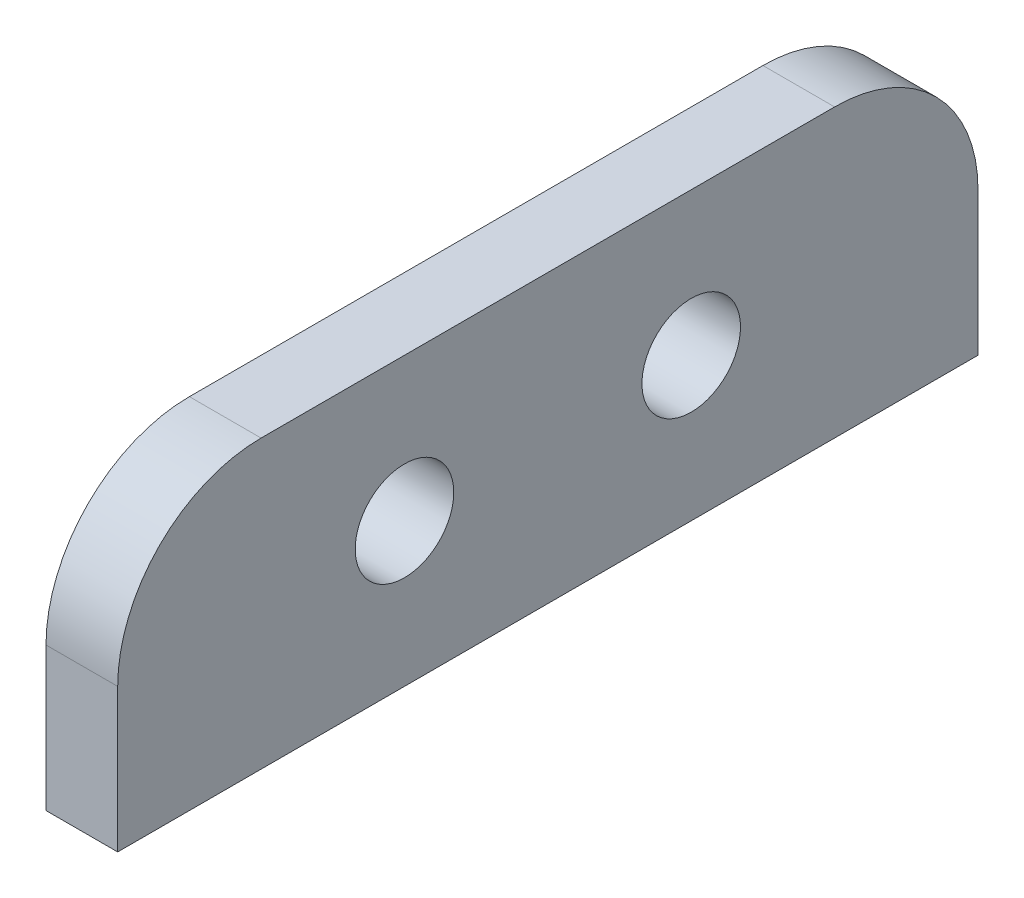
ISO-10303-21;
HEADER;
FILE_DESCRIPTION(('STEP AP214'),'2;1');
FILE_NAME('part.step','',(''),(''),'','','');
FILE_SCHEMA(('AUTOMOTIVE_DESIGN { 1 0 10303 214 1 1 1 1 }'));
ENDSEC;
DATA;
#1=APPLICATION_CONTEXT('core data for automotive mechanical design processes');
#2=APPLICATION_PROTOCOL_DEFINITION('international standard','automotive_design',2000,#1);
#3=PRODUCT_CONTEXT('',#1,'mechanical');
#4=PRODUCT('Part','Part','',(#3));
#5=PRODUCT_RELATED_PRODUCT_CATEGORY('part','',(#4));
#6=PRODUCT_DEFINITION_FORMATION('','',#4);
#7=PRODUCT_DEFINITION_CONTEXT('part definition',#1,'design');
#8=PRODUCT_DEFINITION('design','',#6,#7);
#9=PRODUCT_DEFINITION_SHAPE('','',#8);
#10=(LENGTH_UNIT() NAMED_UNIT(*) SI_UNIT(.MILLI.,.METRE.));
#11=(NAMED_UNIT(*) PLANE_ANGLE_UNIT() SI_UNIT($,.RADIAN.));
#12=(NAMED_UNIT(*) SI_UNIT($,.STERADIAN.) SOLID_ANGLE_UNIT());
#13=UNCERTAINTY_MEASURE_WITH_UNIT(LENGTH_MEASURE(1.E-05),#10,'distance_accuracy_value','');
#14=(GEOMETRIC_REPRESENTATION_CONTEXT(3) GLOBAL_UNCERTAINTY_ASSIGNED_CONTEXT((#13)) GLOBAL_UNIT_ASSIGNED_CONTEXT((#10,
#11,#12)) REPRESENTATION_CONTEXT('',''));
#15=CARTESIAN_POINT('',(0.,0.,0.));
#16=DIRECTION('',(0.,0.,1.));
#17=DIRECTION('',(1.,0.,0.));
#18=AXIS2_PLACEMENT_3D('',#15,#16,#17);
#19=CARTESIAN_POINT('',(4.,0.,0.));
#20=DIRECTION('',(1.,0.,0.));
#21=DIRECTION('',(0.,0.,-1.));
#22=AXIS2_PLACEMENT_3D('',#19,#20,#21);
#23=PLANE('',#22);
#24=CARTESIAN_POINT('',(4.,0.,8.));
#25=DIRECTION('',(1.,0.,0.));
#26=DIRECTION('',(0.,0.,-1.));
#27=AXIS2_PLACEMENT_3D('',#24,#25,#26);
#28=CIRCLE('',#27,2.75);
#29=CARTESIAN_POINT('',(4.,0.,5.25));
#30=VERTEX_POINT('',#29);
#31=EDGE_CURVE('E143',#30,#30,#28,.T.);
#32=ORIENTED_EDGE('',*,*,#31,.F.);
#33=EDGE_LOOP('',(#32));
#34=FACE_BOUND('',#33,.T.);
#35=DIRECTION('',(0.,0.,1.));
#36=VECTOR('',#35,1.);
#37=CARTESIAN_POINT('',(4.,8.,-24.));
#38=LINE('',#37,#36);
#39=CARTESIAN_POINT('',(4.,8.,-16.));
#40=VERTEX_POINT('',#39);
#41=CARTESIAN_POINT('',(4.,8.,16.));
#42=VERTEX_POINT('',#41);
#43=EDGE_CURVE('E115',#40,#42,#38,.T.);
#44=ORIENTED_EDGE('',*,*,#43,.T.);
#45=CARTESIAN_POINT('',(4.,0.,16.));
#46=DIRECTION('',(1.,0.,0.));
#47=DIRECTION('',(0.,0.,-1.));
#48=AXIS2_PLACEMENT_3D('',#45,#46,#47);
#49=CIRCLE('',#48,8.);
#50=CARTESIAN_POINT('',(4.,0.,24.));
#51=VERTEX_POINT('',#50);
#52=EDGE_CURVE('E41',#42,#51,#49,.T.);
#53=ORIENTED_EDGE('',*,*,#52,.T.);
#54=DIRECTION('',(0.,-1.,0.));
#55=VECTOR('',#54,1.);
#56=CARTESIAN_POINT('',(4.,-8.,24.));
#57=LINE('',#56,#55);
#58=CARTESIAN_POINT('',(4.,-8.,24.));
#59=VERTEX_POINT('',#58);
#60=EDGE_CURVE('E87',#51,#59,#57,.T.);
#61=ORIENTED_EDGE('',*,*,#60,.T.);
#62=DIRECTION('',(0.,0.,-1.));
#63=VECTOR('',#62,1.);
#64=CARTESIAN_POINT('',(4.,-8.,-24.));
#65=LINE('',#64,#63);
#66=CARTESIAN_POINT('',(4.,-8.,-24.));
#67=VERTEX_POINT('',#66);
#68=EDGE_CURVE('E90',#59,#67,#65,.T.);
#69=ORIENTED_EDGE('',*,*,#68,.T.);
#70=DIRECTION('',(0.,1.,0.));
#71=VECTOR('',#70,1.);
#72=CARTESIAN_POINT('',(4.,-8.,-24.));
#73=LINE('',#72,#71);
#74=CARTESIAN_POINT('',(4.,0.,-24.));
#75=VERTEX_POINT('',#74);
#76=EDGE_CURVE('E105',#67,#75,#73,.T.);
#77=ORIENTED_EDGE('',*,*,#76,.T.);
#78=CARTESIAN_POINT('',(4.,0.,-16.));
#79=DIRECTION('',(1.,0.,0.));
#80=DIRECTION('',(0.,0.,-1.));
#81=AXIS2_PLACEMENT_3D('',#78,#79,#80);
#82=CIRCLE('',#81,8.);
#83=EDGE_CURVE('E126',#75,#40,#82,.T.);
#84=ORIENTED_EDGE('',*,*,#83,.T.);
#85=EDGE_LOOP('',(#44,#53,#61,#69,#77,#84));
#86=FACE_BOUND('',#85,.T.);
#87=CARTESIAN_POINT('',(4.,0.,-8.));
#88=DIRECTION('',(1.,0.,0.));
#89=DIRECTION('',(0.,0.,-1.));
#90=AXIS2_PLACEMENT_3D('',#87,#88,#89);
#91=CIRCLE('',#90,2.75);
#92=CARTESIAN_POINT('',(4.,0.,-10.75));
#93=VERTEX_POINT('',#92);
#94=EDGE_CURVE('E149',#93,#93,#91,.T.);
#95=ORIENTED_EDGE('',*,*,#94,.F.);
#96=EDGE_LOOP('',(#95));
#97=FACE_BOUND('',#96,.T.);
#98=ADVANCED_FACE('F33',(#34,#86,#97),#23,.T.);
#99=CARTESIAN_POINT('',(0.,0.,0.));
#100=DIRECTION('',(1.,0.,0.));
#101=DIRECTION('',(0.,0.,-1.));
#102=AXIS2_PLACEMENT_3D('',#99,#100,#101);
#103=PLANE('',#102);
#104=DIRECTION('',(0.,-1.,0.));
#105=VECTOR('',#104,1.);
#106=CARTESIAN_POINT('',(0.,-8.,24.));
#107=LINE('',#106,#105);
#108=CARTESIAN_POINT('',(0.,0.,24.));
#109=VERTEX_POINT('',#108);
#110=CARTESIAN_POINT('',(0.,-8.,24.));
#111=VERTEX_POINT('',#110);
#112=EDGE_CURVE('E109',#109,#111,#107,.T.);
#113=ORIENTED_EDGE('',*,*,#112,.F.);
#114=CARTESIAN_POINT('',(0.,0.,16.));
#115=DIRECTION('',(1.,0.,0.));
#116=DIRECTION('',(0.,0.,-1.));
#117=AXIS2_PLACEMENT_3D('',#114,#115,#116);
#118=CIRCLE('',#117,8.);
#119=CARTESIAN_POINT('',(0.,8.,16.));
#120=VERTEX_POINT('',#119);
#121=EDGE_CURVE('E120',#109,#120,#118,.F.);
#122=ORIENTED_EDGE('',*,*,#121,.T.);
#123=DIRECTION('',(0.,0.,1.));
#124=VECTOR('',#123,1.);
#125=CARTESIAN_POINT('',(0.,8.,-24.));
#126=LINE('',#125,#124);
#127=CARTESIAN_POINT('',(0.,8.,-16.));
#128=VERTEX_POINT('',#127);
#129=EDGE_CURVE('E97',#128,#120,#126,.T.);
#130=ORIENTED_EDGE('',*,*,#129,.F.);
#131=CARTESIAN_POINT('',(0.,0.,-16.));
#132=DIRECTION('',(1.,0.,0.));
#133=DIRECTION('',(0.,0.,-1.));
#134=AXIS2_PLACEMENT_3D('',#131,#132,#133);
#135=CIRCLE('',#134,8.);
#136=CARTESIAN_POINT('',(0.,0.,-24.));
#137=VERTEX_POINT('',#136);
#138=EDGE_CURVE('E113',#128,#137,#135,.F.);
#139=ORIENTED_EDGE('',*,*,#138,.T.);
#140=DIRECTION('',(0.,1.,0.));
#141=VECTOR('',#140,1.);
#142=CARTESIAN_POINT('',(0.,-8.,-24.));
#143=LINE('',#142,#141);
#144=CARTESIAN_POINT('',(0.,-8.,-24.));
#145=VERTEX_POINT('',#144);
#146=EDGE_CURVE('E137',#145,#137,#143,.T.);
#147=ORIENTED_EDGE('',*,*,#146,.F.);
#148=DIRECTION('',(0.,0.,-1.));
#149=VECTOR('',#148,1.);
#150=CARTESIAN_POINT('',(0.,-8.,-24.));
#151=LINE('',#150,#149);
#152=EDGE_CURVE('E139',#111,#145,#151,.T.);
#153=ORIENTED_EDGE('',*,*,#152,.F.);
#154=EDGE_LOOP('',(#113,#122,#130,#139,#147,#153));
#155=FACE_BOUND('',#154,.T.);
#156=CARTESIAN_POINT('',(0.,0.,8.));
#157=DIRECTION('',(1.,0.,0.));
#158=DIRECTION('',(0.,0.,-1.));
#159=AXIS2_PLACEMENT_3D('',#156,#157,#158);
#160=CIRCLE('',#159,2.75);
#161=CARTESIAN_POINT('',(0.,0.,5.25));
#162=VERTEX_POINT('',#161);
#163=EDGE_CURVE('E146',#162,#162,#160,.T.);
#164=ORIENTED_EDGE('',*,*,#163,.T.);
#165=EDGE_LOOP('',(#164));
#166=FACE_BOUND('',#165,.T.);
#167=CARTESIAN_POINT('',(0.,0.,-8.));
#168=DIRECTION('',(1.,0.,0.));
#169=DIRECTION('',(0.,0.,-1.));
#170=AXIS2_PLACEMENT_3D('',#167,#168,#169);
#171=CIRCLE('',#170,2.75);
#172=CARTESIAN_POINT('',(0.,0.,-10.75));
#173=VERTEX_POINT('',#172);
#174=EDGE_CURVE('E152',#173,#173,#171,.T.);
#175=ORIENTED_EDGE('',*,*,#174,.T.);
#176=EDGE_LOOP('',(#175));
#177=FACE_BOUND('',#176,.T.);
#178=ADVANCED_FACE('F135',(#155,#166,#177),#103,.F.);
#179=CARTESIAN_POINT('',(4.,-8.,24.));
#180=DIRECTION('',(0.,0.,-1.));
#181=DIRECTION('',(-1.,0.,0.));
#182=AXIS2_PLACEMENT_3D('',#179,#180,#181);
#183=PLANE('',#182);
#184=ORIENTED_EDGE('',*,*,#60,.F.);
#185=DIRECTION('',(-1.,0.,0.));
#186=VECTOR('',#185,1.);
#187=CARTESIAN_POINT('',(4.,0.,24.));
#188=LINE('',#187,#186);
#189=EDGE_CURVE('E111',#51,#109,#188,.T.);
#190=ORIENTED_EDGE('',*,*,#189,.T.);
#191=ORIENTED_EDGE('',*,*,#112,.T.);
#192=DIRECTION('',(-1.,0.,0.));
#193=VECTOR('',#192,1.);
#194=CARTESIAN_POINT('',(4.,-8.,24.));
#195=LINE('',#194,#193);
#196=EDGE_CURVE('E102',#59,#111,#195,.T.);
#197=ORIENTED_EDGE('',*,*,#196,.F.);
#198=EDGE_LOOP('',(#184,#190,#191,#197));
#199=FACE_BOUND('',#198,.T.);
#200=ADVANCED_FACE('F107',(#199),#183,.F.);
#201=CARTESIAN_POINT('',(4.,-8.,-24.));
#202=DIRECTION('',(0.,1.,0.));
#203=DIRECTION('',(0.,0.,1.));
#204=AXIS2_PLACEMENT_3D('',#201,#202,#203);
#205=PLANE('',#204);
#206=ORIENTED_EDGE('',*,*,#152,.T.);
#207=DIRECTION('',(-1.,0.,0.));
#208=VECTOR('',#207,1.);
#209=CARTESIAN_POINT('',(4.,-8.,-24.));
#210=LINE('',#209,#208);
#211=EDGE_CURVE('E104',#67,#145,#210,.T.);
#212=ORIENTED_EDGE('',*,*,#211,.F.);
#213=ORIENTED_EDGE('',*,*,#68,.F.);
#214=ORIENTED_EDGE('',*,*,#196,.T.);
#215=EDGE_LOOP('',(#206,#212,#213,#214));
#216=FACE_BOUND('',#215,.T.);
#217=ADVANCED_FACE('F101',(#216),#205,.F.);
#218=CARTESIAN_POINT('',(4.,-8.,-24.));
#219=DIRECTION('',(0.,0.,1.));
#220=DIRECTION('',(1.,0.,0.));
#221=AXIS2_PLACEMENT_3D('',#218,#219,#220);
#222=PLANE('',#221);
#223=ORIENTED_EDGE('',*,*,#146,.T.);
#224=DIRECTION('',(-1.,0.,0.));
#225=VECTOR('',#224,1.);
#226=CARTESIAN_POINT('',(4.,0.,-24.));
#227=LINE('',#226,#225);
#228=EDGE_CURVE('E11',#137,#75,#227,.F.);
#229=ORIENTED_EDGE('',*,*,#228,.T.);
#230=ORIENTED_EDGE('',*,*,#76,.F.);
#231=ORIENTED_EDGE('',*,*,#211,.T.);
#232=EDGE_LOOP('',(#223,#229,#230,#231));
#233=FACE_BOUND('',#232,.T.);
#234=ADVANCED_FACE('F138',(#233),#222,.F.);
#235=CARTESIAN_POINT('',(4.,8.,-24.));
#236=DIRECTION('',(0.,-1.,0.));
#237=DIRECTION('',(0.,0.,-1.));
#238=AXIS2_PLACEMENT_3D('',#235,#236,#237);
#239=PLANE('',#238);
#240=ORIENTED_EDGE('',*,*,#129,.T.);
#241=DIRECTION('',(-1.,0.,0.));
#242=VECTOR('',#241,1.);
#243=CARTESIAN_POINT('',(4.,8.,16.));
#244=LINE('',#243,#242);
#245=EDGE_CURVE('E54',#120,#42,#244,.F.);
#246=ORIENTED_EDGE('',*,*,#245,.T.);
#247=ORIENTED_EDGE('',*,*,#43,.F.);
#248=DIRECTION('',(-1.,0.,0.));
#249=VECTOR('',#248,1.);
#250=CARTESIAN_POINT('',(4.,8.,-16.));
#251=LINE('',#250,#249);
#252=EDGE_CURVE('E122',#40,#128,#251,.T.);
#253=ORIENTED_EDGE('',*,*,#252,.T.);
#254=EDGE_LOOP('',(#240,#246,#247,#253));
#255=FACE_BOUND('',#254,.T.);
#256=ADVANCED_FACE('F130',(#255),#239,.F.);
#257=CARTESIAN_POINT('',(4.,0.,8.));
#258=DIRECTION('',(-1.,0.,0.));
#259=DIRECTION('',(0.,0.,1.));
#260=AXIS2_PLACEMENT_3D('',#257,#258,#259);
#261=CYLINDRICAL_SURFACE('',#260,2.75);
#262=ORIENTED_EDGE('',*,*,#31,.T.);
#263=EDGE_LOOP('',(#262));
#264=FACE_BOUND('',#263,.T.);
#265=ORIENTED_EDGE('',*,*,#163,.F.);
#266=EDGE_LOOP('',(#265));
#267=FACE_BOUND('',#266,.T.);
#268=ADVANCED_FACE('F169',(#264,#267),#261,.F.);
#269=CARTESIAN_POINT('',(4.,0.,-8.));
#270=DIRECTION('',(-1.,0.,0.));
#271=DIRECTION('',(0.,0.,1.));
#272=AXIS2_PLACEMENT_3D('',#269,#270,#271);
#273=CYLINDRICAL_SURFACE('',#272,2.75);
#274=ORIENTED_EDGE('',*,*,#94,.T.);
#275=EDGE_LOOP('',(#274));
#276=FACE_BOUND('',#275,.T.);
#277=ORIENTED_EDGE('',*,*,#174,.F.);
#278=EDGE_LOOP('',(#277));
#279=FACE_BOUND('',#278,.T.);
#280=ADVANCED_FACE('F158',(#276,#279),#273,.F.);
#281=CARTESIAN_POINT('',(4.,0.,16.));
#282=DIRECTION('',(-1.,0.,0.));
#283=DIRECTION('',(0.,0.,1.));
#284=AXIS2_PLACEMENT_3D('',#281,#282,#283);
#285=CYLINDRICAL_SURFACE('',#284,8.);
#286=ORIENTED_EDGE('',*,*,#52,.F.);
#287=ORIENTED_EDGE('',*,*,#245,.F.);
#288=ORIENTED_EDGE('',*,*,#121,.F.);
#289=ORIENTED_EDGE('',*,*,#189,.F.);
#290=EDGE_LOOP('',(#286,#287,#288,#289));
#291=FACE_BOUND('',#290,.T.);
#292=ADVANCED_FACE('F179',(#291),#285,.T.);
#293=CARTESIAN_POINT('',(4.,0.,-16.));
#294=DIRECTION('',(-1.,0.,0.));
#295=DIRECTION('',(0.,0.,1.));
#296=AXIS2_PLACEMENT_3D('',#293,#294,#295);
#297=CYLINDRICAL_SURFACE('',#296,8.);
#298=ORIENTED_EDGE('',*,*,#83,.F.);
#299=ORIENTED_EDGE('',*,*,#228,.F.);
#300=ORIENTED_EDGE('',*,*,#138,.F.);
#301=ORIENTED_EDGE('',*,*,#252,.F.);
#302=EDGE_LOOP('',(#298,#299,#300,#301));
#303=FACE_BOUND('',#302,.T.);
#304=ADVANCED_FACE('F35',(#303),#297,.T.);
#305=CLOSED_SHELL('',(#98,#178,#200,#217,#234,#256,#268,#280,#292,#304));
#306=MANIFOLD_SOLID_BREP('B2',#305);
#307=ADVANCED_BREP_SHAPE_REPRESENTATION('',(#18,#306),#14);
#308=SHAPE_DEFINITION_REPRESENTATION(#9,#307);
ENDSEC;
END-ISO-10303-21;
